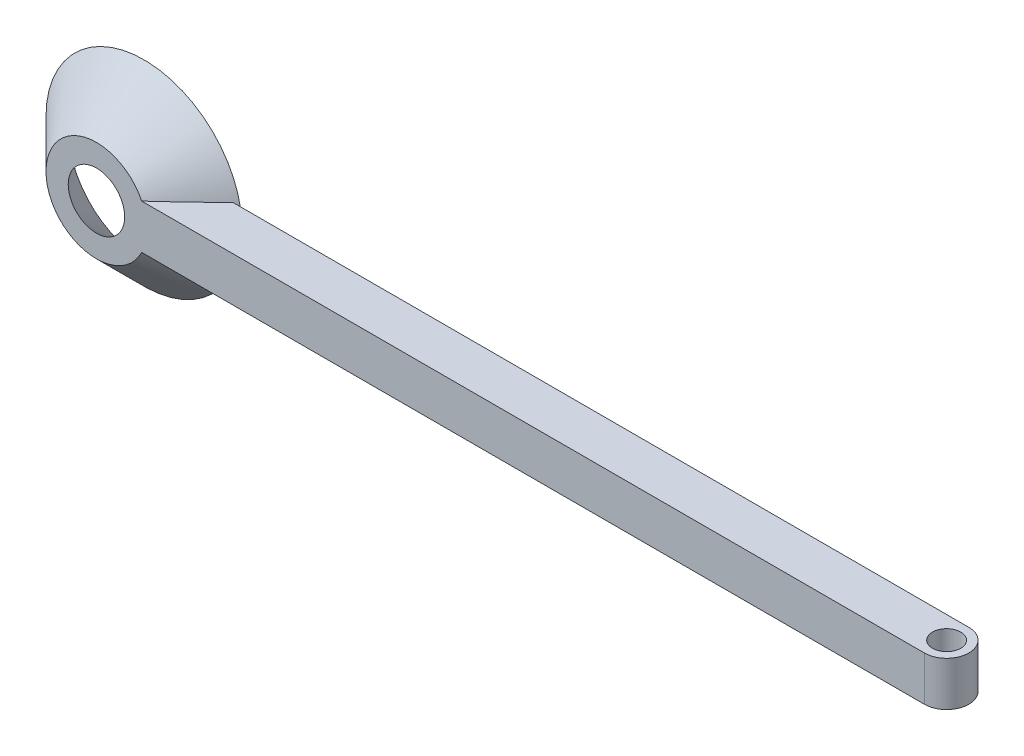
ISO-10303-21;
HEADER;
FILE_DESCRIPTION(('STEP AP214'),'2;1');
FILE_NAME('part.step','',(''),(''),'','','');
FILE_SCHEMA(('AUTOMOTIVE_DESIGN { 1 0 10303 214 1 1 1 1 }'));
ENDSEC;
DATA;
#1=APPLICATION_CONTEXT('core data for automotive mechanical design processes');
#2=APPLICATION_PROTOCOL_DEFINITION('international standard','automotive_design',2000,#1);
#3=PRODUCT_CONTEXT('',#1,'mechanical');
#4=PRODUCT('Part','Part','',(#3));
#5=PRODUCT_RELATED_PRODUCT_CATEGORY('part','',(#4));
#6=PRODUCT_DEFINITION_FORMATION('','',#4);
#7=PRODUCT_DEFINITION_CONTEXT('part definition',#1,'design');
#8=PRODUCT_DEFINITION('design','',#6,#7);
#9=PRODUCT_DEFINITION_SHAPE('','',#8);
#10=(LENGTH_UNIT() NAMED_UNIT(*) SI_UNIT(.MILLI.,.METRE.));
#11=(NAMED_UNIT(*) PLANE_ANGLE_UNIT() SI_UNIT($,.RADIAN.));
#12=(NAMED_UNIT(*) SI_UNIT($,.STERADIAN.) SOLID_ANGLE_UNIT());
#13=UNCERTAINTY_MEASURE_WITH_UNIT(LENGTH_MEASURE(1.E-05),#10,'distance_accuracy_value','');
#14=(GEOMETRIC_REPRESENTATION_CONTEXT(3) GLOBAL_UNCERTAINTY_ASSIGNED_CONTEXT((#13)) GLOBAL_UNIT_ASSIGNED_CONTEXT((#10,
#11,#12)) REPRESENTATION_CONTEXT('',''));
#15=CARTESIAN_POINT('',(0.,0.,0.));
#16=DIRECTION('',(0.,0.,1.));
#17=DIRECTION('',(1.,0.,0.));
#18=AXIS2_PLACEMENT_3D('',#15,#16,#17);
#19=CARTESIAN_POINT('',(0.,-5.,-5.));
#20=DIRECTION('',(0.,0.,-1.));
#21=DIRECTION('',(-1.,0.,0.));
#22=AXIS2_PLACEMENT_3D('',#19,#20,#21);
#23=PLANE('',#22);
#24=DIRECTION('',(-1.,0.,0.));
#25=VECTOR('',#24,1.);
#26=CARTESIAN_POINT('',(0.,-5.,-5.));
#27=LINE('',#26,#25);
#28=CARTESIAN_POINT('',(90.,-5.,-5.00000000000001));
#29=VERTEX_POINT('',#28);
#30=CARTESIAN_POINT('',(-75.5937358852803,-5.,-4.99999999999999));
#31=VERTEX_POINT('',#30);
#32=EDGE_CURVE('E98',#29,#31,#27,.T.);
#33=ORIENTED_EDGE('',*,*,#32,.T.);
#34=CARTESIAN_POINT('',(-96.35,0.,-4.99999999999999));
#35=DIRECTION('',(0.,0.,-1.));
#36=DIRECTION('',(-1.,0.,0.));
#37=AXIS2_PLACEMENT_3D('',#34,#35,#36);
#38=CIRCLE('',#37,21.35);
#39=CARTESIAN_POINT('',(-75.5937358852803,5.,-4.99999999999999));
#40=VERTEX_POINT('',#39);
#41=EDGE_CURVE('E81',#31,#40,#38,.F.);
#42=ORIENTED_EDGE('',*,*,#41,.T.);
#43=DIRECTION('',(-1.,0.,0.));
#44=VECTOR('',#43,1.);
#45=CARTESIAN_POINT('',(0.,5.,-5.));
#46=LINE('',#45,#44);
#47=CARTESIAN_POINT('',(90.,5.,-5.00000000000001));
#48=VERTEX_POINT('',#47);
#49=EDGE_CURVE('E111',#48,#40,#46,.T.);
#50=ORIENTED_EDGE('',*,*,#49,.F.);
#51=DIRECTION('',(0.,1.,0.));
#52=VECTOR('',#51,1.);
#53=CARTESIAN_POINT('',(90.,-5.,-5.00000000000001));
#54=LINE('',#53,#52);
#55=EDGE_CURVE('E97',#29,#48,#54,.T.);
#56=ORIENTED_EDGE('',*,*,#55,.F.);
#57=EDGE_LOOP('',(#33,#42,#50,#56));
#58=FACE_BOUND('',#57,.T.);
#59=ADVANCED_FACE('F35',(#58),#23,.T.);
#60=CARTESIAN_POINT('',(0.,-5.,0.));
#61=DIRECTION('',(0.,1.,0.));
#62=DIRECTION('',(0.,0.,1.));
#63=AXIS2_PLACEMENT_3D('',#60,#61,#62);
#64=PLANE('',#63);
#65=CARTESIAN_POINT('',(89.9999999999996,-5.,0.));
#66=DIRECTION('',(0.,1.,0.));
#67=DIRECTION('',(0.,0.,1.));
#68=AXIS2_PLACEMENT_3D('',#65,#66,#67);
#69=CIRCLE('',#68,3.17500000000001);
#70=CARTESIAN_POINT('',(89.9999999999996,-5.,3.175));
#71=VERTEX_POINT('',#70);
#72=EDGE_CURVE('E114',#71,#71,#69,.T.);
#73=ORIENTED_EDGE('',*,*,#72,.T.);
#74=EDGE_LOOP('',(#73));
#75=FACE_BOUND('',#74,.T.);
#76=CARTESIAN_POINT('',(-64.2027052285069,-5.,-16.1838064346191));
#77=CARTESIAN_POINT('',(-65.1454306610586,-5.,-15.2523281294728));
#78=CARTESIAN_POINT('',(-66.0885952776533,-5.,-14.3212933647983));
#79=CARTESIAN_POINT('',(-67.9767967716227,-5.,-12.4599410588139));
#80=CARTESIAN_POINT('',(-68.9218344516001,-5.,-11.529624331802));
#81=CARTESIAN_POINT('',(-70.8247178125633,-5.,-9.65977743919224));
#82=CARTESIAN_POINT('',(-71.7825834387421,-5.,-8.72026755784174));
#83=CARTESIAN_POINT('',(-73.2209120631241,-5.,-7.31315535013858));
#84=CARTESIAN_POINT('',(-73.7004624884924,-5.,-6.84462024994699));
#85=CARTESIAN_POINT('',(-74.6602905034531,-5.,-5.90830952626677));
#86=CARTESIAN_POINT('',(-75.140568082258,-5.,-5.44053389172052));
#87=CARTESIAN_POINT('',(-76.2860921001571,-5.,-4.32694382062105));
#88=CARTESIAN_POINT('',(-76.9517431387911,-5.,-3.68154528667366));
#89=CARTESIAN_POINT('',(-78.2853525297144,-5.,-2.39304950100073));
#90=CARTESIAN_POINT('',(-78.9533110276313,-5.,-1.7499523999368));
#91=CARTESIAN_POINT('',(-80.2937894091304,-5.,-0.465609860279055));
#92=CARTESIAN_POINT('',(-80.9663160394032,-5.,0.175628549114005));
#93=CARTESIAN_POINT('',(-81.9783990708816,-5.,1.13384877718588));
#94=CARTESIAN_POINT('',(-82.3162687932676,-5.,1.45261182123128));
#95=CARTESIAN_POINT('',(-82.9933877210529,-5.,2.08866879221842));
#96=CARTESIAN_POINT('',(-83.3326369233067,-5.,2.40596272250663));
#97=CARTESIAN_POINT('',(-84.0097154514108,-5.,3.03582215147635));
#98=CARTESIAN_POINT('',(-84.3475292524504,-5.,3.34840432488952));
#99=CARTESIAN_POINT('',(-85.0252441039228,-5.,3.97129814173362));
#100=CARTESIAN_POINT('',(-85.3651451498662,-5.,4.28160979004502));
#101=CARTESIAN_POINT('',(-86.0479259062229,-5.,4.89960317193267));
#102=CARTESIAN_POINT('',(-86.3908081502565,-5.,5.20728211232001));
#103=CARTESIAN_POINT('',(-86.9077081555876,-5.,5.66587227548237));
#104=CARTESIAN_POINT('',(-87.0804314232372,-5.,5.81824226774713));
#105=CARTESIAN_POINT('',(-87.4268824429795,-5.,6.12184856185156));
#106=CARTESIAN_POINT('',(-87.6006102346148,-5.,6.27308481851691));
#107=CARTESIAN_POINT('',(-88.1221189759651,-5.,6.7236177155396));
#108=CARTESIAN_POINT('',(-88.4715988973691,-5.,7.02096187775687));
#109=CARTESIAN_POINT('',(-89.0004279603917,-5.,7.46142396905846));
#110=CARTESIAN_POINT('',(-89.1774681399129,-5.,7.60731548564141));
#111=CARTESIAN_POINT('',(-89.5333724860336,-5.,7.89685420601316));
#112=CARTESIAN_POINT('',(-89.7122366186847,-5.,8.04050145144804));
#113=CARTESIAN_POINT('',(-90.0718710533435,-5.,8.32486434385216));
#114=CARTESIAN_POINT('',(-90.2526382847953,-5.,8.46558386731626));
#115=CARTESIAN_POINT('',(-90.6167387746962,-5.,8.74365633336697));
#116=CARTESIAN_POINT('',(-90.8000719190565,-5.,8.88100942489364));
#117=CARTESIAN_POINT('',(-91.1697427015212,-5.,9.15144550857356));
#118=CARTESIAN_POINT('',(-91.3560789653121,-5.,9.2845303750431));
#119=CARTESIAN_POINT('',(-91.7324519069781,-5.,9.5453456602855));
#120=CARTESIAN_POINT('',(-91.9224880538725,-5.,9.67307683920577));
#121=CARTESIAN_POINT('',(-92.1615530159626,-5.,9.82759082502684));
#122=CARTESIAN_POINT('',(-92.2084836399834,-5.,9.85763267640777));
#123=CARTESIAN_POINT('',(-92.302625989668,-5.,9.91727832985348));
#124=CARTESIAN_POINT('',(-92.3498377297726,-5.,9.94688210913769));
#125=CARTESIAN_POINT('',(-92.4919192380772,-5.,10.0349969014896));
#126=CARTESIAN_POINT('',(-92.5872262886891,-5.,10.0928055341881));
#127=CARTESIAN_POINT('',(-92.7791222521322,-5.,10.2062895099608));
#128=CARTESIAN_POINT('',(-92.8757113300107,-5.,10.2619645747035));
#129=CARTESIAN_POINT('',(-93.0702626609801,-5.,10.3708540094377));
#130=CARTESIAN_POINT('',(-93.1682248937748,-5.,10.4240684157499));
#131=CARTESIAN_POINT('',(-93.4630645210796,-5.,10.5788246801675));
#132=CARTESIAN_POINT('',(-93.662149132975,-5.,10.6762317463084));
#133=CARTESIAN_POINT('',(-94.0669035656325,-5.,10.8563908960805));
#134=CARTESIAN_POINT('',(-94.2725716502911,-5.,10.9391468063276));
#135=CARTESIAN_POINT('',(-94.6277505258524,-5.,11.0634675144655));
#136=CARTESIAN_POINT('',(-94.7755380492069,-5.,11.1099339764786));
#137=CARTESIAN_POINT('',(-95.0741592179826,-5.,11.1917860860787));
#138=CARTESIAN_POINT('',(-95.2249921702169,-5.,11.2271742256607));
#139=CARTESIAN_POINT('',(-95.5282907343687,-5.,11.2851024475581));
#140=CARTESIAN_POINT('',(-95.680743035165,-5.,11.3077112456342));
#141=CARTESIAN_POINT('',(-95.9870800296896,-5.,11.3391604241388));
#142=CARTESIAN_POINT('',(-96.1409646747562,-5.,11.3480012706082));
#143=CARTESIAN_POINT('',(-96.4490419580736,-5.,11.3513938215267));
#144=CARTESIAN_POINT('',(-96.6032347501485,-5.,11.3459318326825));
#145=CARTESIAN_POINT('',(-96.910477214965,-5.,11.3210164301969));
#146=CARTESIAN_POINT('',(-97.0635267956689,-5.,11.301561902053));
#147=CARTESIAN_POINT('',(-97.3691861766345,-5.,11.2494336800775));
#148=CARTESIAN_POINT('',(-97.5217695109291,-5.,11.2166068162567));
#149=CARTESIAN_POINT('',(-97.8238991092357,-5.,11.1393339010768));
#150=CARTESIAN_POINT('',(-97.9734455468259,-5.,11.0948885158159));
#151=CARTESIAN_POINT('',(-98.401960649359,-5.,10.9518087643451));
#152=CARTESIAN_POINT('',(-98.6766652650818,-5.,10.840333444393));
#153=CARTESIAN_POINT('',(-99.0801058917182,-5.,10.6544567433044));
#154=CARTESIAN_POINT('',(-99.2133317962307,-5.,10.5892820905881));
#155=CARTESIAN_POINT('',(-99.4771129076315,-5.,10.4537273994035));
#156=CARTESIAN_POINT('',(-99.607668438466,-5.,10.383347997168));
#157=CARTESIAN_POINT('',(-99.8618684316424,-5.,10.2407828565494));
#158=CARTESIAN_POINT('',(-99.9855958014017,-5.,10.1687436198021));
#159=CARTESIAN_POINT('',(-100.231023361649,-5.,10.0212778174012));
#160=CARTESIAN_POINT('',(-100.352723414586,-5.,9.94585102317874));
#161=CARTESIAN_POINT('',(-100.593580277383,-5.,9.79260877394597));
#162=CARTESIAN_POINT('',(-100.712747955537,-5.,9.7148103359953));
#163=CARTESIAN_POINT('',(-100.949447609256,-5.,9.55682605176389));
#164=CARTESIAN_POINT('',(-101.066979998045,-5.,9.47664082529422));
#165=CARTESIAN_POINT('',(-101.183806434619,-5.,9.39545582749201));
#166=B_SPLINE_CURVE_WITH_KNOTS('',3,(#76,#77,#78,#79,#80,#81,#82,#83,#84,#85,#86,#87,#88,#89,
#90,#91,#92,#93,#94,#95,#96,#97,#98,#99,#100,#101,#102,#103,#104,#105,#106,#107,#108,#109,#110,
#111,#112,#113,#114,#115,#116,#117,#118,#119,#120,#121,#122,#123,#124,#125,#126,#127,#128,#129,
#130,#131,#132,#133,#134,#135,#136,#137,#138,#139,#140,#141,#142,#143,#144,#145,#146,#147,#148,
#149,#150,#151,#152,#153,#154,#155,#156,#157,#158,#159,#160,#161,#162,#163,#164,#165),
.UNSPECIFIED.,.F.,.F.,(4,2,2,2,2,2,2,2,2,2,2,2,2,2,2,2,2,2,2,2,2,2,2,2,2,2,2,2,2,2,2,2,2,2,2,2,
2,2,2,2,2,2,2,2,4),(0.,3.97585889793892,7.95420766716726,11.9793335614988,13.9906617333336,
16.0019603532867,18.7834437774279,21.5651060751781,24.352794277439,25.7463089491354,
27.1398204449989,28.5205482226047,29.9012730314879,31.2833158362956,31.97428820838,
32.6652879678378,34.0417695952898,34.7299768588404,35.41817133639,36.105387684535,
36.7925735732848,37.4794534453911,38.1662354576484,38.3334011522863,38.5005755095169,
38.8349564103307,39.169380784854,39.5038002215336,40.1682572162939,40.8325404100985,
41.2969443055918,41.761243661324,42.2230220866671,42.6847848806163,43.1469899200689,
43.6092317781263,44.076924202512,44.5445898196285,45.4318504103131,45.8767371063952,
46.3215695087672,46.7510275730483,47.1805146578308,47.6074287678956,48.0342329660593),.UNSPECIFIED.);
#167=CARTESIAN_POINT('',(-86.1606673427549,-5.,4.99999999999999));
#168=VERTEX_POINT('',#167);
#169=EDGE_CURVE('E78',#31,#168,#166,.T.);
#170=ORIENTED_EDGE('',*,*,#169,.F.);
#171=ORIENTED_EDGE('',*,*,#32,.F.);
#172=CARTESIAN_POINT('',(89.9999999999996,-5.,0.));
#173=DIRECTION('',(0.,1.,0.));
#174=DIRECTION('',(0.,0.,1.));
#175=AXIS2_PLACEMENT_3D('',#172,#173,#174);
#176=CIRCLE('',#175,5.);
#177=CARTESIAN_POINT('',(90.,-5.,4.99999999999999));
#178=VERTEX_POINT('',#177);
#179=EDGE_CURVE('E95',#29,#178,#176,.F.);
#180=ORIENTED_EDGE('',*,*,#179,.T.);
#181=DIRECTION('',(-1.,0.,0.));
#182=VECTOR('',#181,1.);
#183=CARTESIAN_POINT('',(0.,-5.,5.));
#184=LINE('',#183,#182);
#185=EDGE_CURVE('E61',#178,#168,#184,.T.);
#186=ORIENTED_EDGE('',*,*,#185,.T.);
#187=EDGE_LOOP('',(#170,#171,#180,#186));
#188=FACE_BOUND('',#187,.T.);
#189=ADVANCED_FACE('F93',(#75,#188),#64,.F.);
#190=CARTESIAN_POINT('',(0.,5.,0.));
#191=DIRECTION('',(0.,1.,0.));
#192=DIRECTION('',(0.,0.,1.));
#193=AXIS2_PLACEMENT_3D('',#190,#191,#192);
#194=PLANE('',#193);
#195=CARTESIAN_POINT('',(89.9999999999996,5.,0.));
#196=DIRECTION('',(0.,1.,0.));
#197=DIRECTION('',(0.,0.,1.));
#198=AXIS2_PLACEMENT_3D('',#195,#196,#197);
#199=CIRCLE('',#198,3.17500000000001);
#200=CARTESIAN_POINT('',(89.9999999999996,5.,3.175));
#201=VERTEX_POINT('',#200);
#202=EDGE_CURVE('E85',#201,#201,#199,.T.);
#203=ORIENTED_EDGE('',*,*,#202,.F.);
#204=EDGE_LOOP('',(#203));
#205=FACE_BOUND('',#204,.T.);
#206=ORIENTED_EDGE('',*,*,#49,.T.);
#207=CARTESIAN_POINT('',(-64.2027052285069,5.,-16.1838064346191));
#208=CARTESIAN_POINT('',(-65.1454306610586,5.,-15.2523281294728));
#209=CARTESIAN_POINT('',(-66.0885952776533,5.,-14.3212933647983));
#210=CARTESIAN_POINT('',(-67.9767967716227,5.,-12.4599410588139));
#211=CARTESIAN_POINT('',(-68.9218344516001,5.,-11.529624331802));
#212=CARTESIAN_POINT('',(-70.8247178125633,5.,-9.65977743919224));
#213=CARTESIAN_POINT('',(-71.7825834387421,5.,-8.72026755784174));
#214=CARTESIAN_POINT('',(-73.2209120631241,5.,-7.31315535013858));
#215=CARTESIAN_POINT('',(-73.7004624884924,5.,-6.84462024994699));
#216=CARTESIAN_POINT('',(-74.6602905034531,5.,-5.90830952626677));
#217=CARTESIAN_POINT('',(-75.140568082258,5.,-5.44053389172052));
#218=CARTESIAN_POINT('',(-76.2860921001571,5.,-4.32694382062105));
#219=CARTESIAN_POINT('',(-76.9517431387911,5.,-3.68154528667366));
#220=CARTESIAN_POINT('',(-78.2853525297144,5.,-2.39304950100073));
#221=CARTESIAN_POINT('',(-78.9533110276313,5.,-1.7499523999368));
#222=CARTESIAN_POINT('',(-80.2937894091304,5.,-0.465609860279055));
#223=CARTESIAN_POINT('',(-80.9663160394032,5.,0.175628549114005));
#224=CARTESIAN_POINT('',(-81.9783990708816,5.,1.13384877718588));
#225=CARTESIAN_POINT('',(-82.3162687932676,5.,1.45261182123128));
#226=CARTESIAN_POINT('',(-82.9933877210529,5.,2.08866879221842));
#227=CARTESIAN_POINT('',(-83.3326369233067,5.,2.40596272250663));
#228=CARTESIAN_POINT('',(-84.0097154514108,5.,3.03582215147635));
#229=CARTESIAN_POINT('',(-84.3475292524504,5.,3.34840432488952));
#230=CARTESIAN_POINT('',(-85.0252441039228,5.,3.97129814173362));
#231=CARTESIAN_POINT('',(-85.3651451498662,5.,4.28160979004502));
#232=CARTESIAN_POINT('',(-86.0479259062229,5.,4.89960317193267));
#233=CARTESIAN_POINT('',(-86.3908081502565,5.,5.20728211232001));
#234=CARTESIAN_POINT('',(-86.9077081555876,5.,5.66587227548237));
#235=CARTESIAN_POINT('',(-87.0804314232372,5.,5.81824226774713));
#236=CARTESIAN_POINT('',(-87.4268824429795,5.,6.12184856185156));
#237=CARTESIAN_POINT('',(-87.6006102346148,5.,6.27308481851691));
#238=CARTESIAN_POINT('',(-88.1221189759651,5.,6.7236177155396));
#239=CARTESIAN_POINT('',(-88.4715988973691,5.,7.02096187775687));
#240=CARTESIAN_POINT('',(-89.0004279603917,5.,7.46142396905846));
#241=CARTESIAN_POINT('',(-89.1774681399129,5.,7.60731548564141));
#242=CARTESIAN_POINT('',(-89.5333724860336,5.,7.89685420601316));
#243=CARTESIAN_POINT('',(-89.7122366186847,5.,8.04050145144804));
#244=CARTESIAN_POINT('',(-90.0718710533435,5.,8.32486434385216));
#245=CARTESIAN_POINT('',(-90.2526382847953,5.,8.46558386731626));
#246=CARTESIAN_POINT('',(-90.6167387746962,5.,8.74365633336697));
#247=CARTESIAN_POINT('',(-90.8000719190565,5.,8.88100942489364));
#248=CARTESIAN_POINT('',(-91.1697427015212,5.,9.15144550857356));
#249=CARTESIAN_POINT('',(-91.3560789653121,5.,9.2845303750431));
#250=CARTESIAN_POINT('',(-91.7324519069781,5.,9.5453456602855));
#251=CARTESIAN_POINT('',(-91.9224880538725,5.,9.67307683920577));
#252=CARTESIAN_POINT('',(-92.1615530159626,5.,9.82759082502684));
#253=CARTESIAN_POINT('',(-92.2084836399834,5.,9.85763267640777));
#254=CARTESIAN_POINT('',(-92.302625989668,5.,9.91727832985348));
#255=CARTESIAN_POINT('',(-92.3498377297726,5.,9.94688210913769));
#256=CARTESIAN_POINT('',(-92.4919192380772,5.,10.0349969014896));
#257=CARTESIAN_POINT('',(-92.5872262886891,5.,10.0928055341881));
#258=CARTESIAN_POINT('',(-92.7791222521322,5.,10.2062895099608));
#259=CARTESIAN_POINT('',(-92.8757113300107,5.,10.2619645747035));
#260=CARTESIAN_POINT('',(-93.0702626609801,5.,10.3708540094377));
#261=CARTESIAN_POINT('',(-93.1682248937748,5.,10.4240684157499));
#262=CARTESIAN_POINT('',(-93.4630645210796,5.,10.5788246801675));
#263=CARTESIAN_POINT('',(-93.662149132975,5.,10.6762317463084));
#264=CARTESIAN_POINT('',(-94.0669035656325,5.,10.8563908960805));
#265=CARTESIAN_POINT('',(-94.2725716502911,5.,10.9391468063276));
#266=CARTESIAN_POINT('',(-94.6277505258524,5.,11.0634675144655));
#267=CARTESIAN_POINT('',(-94.7755380492069,5.,11.1099339764786));
#268=CARTESIAN_POINT('',(-95.0741592179826,5.,11.1917860860787));
#269=CARTESIAN_POINT('',(-95.2249921702169,5.,11.2271742256607));
#270=CARTESIAN_POINT('',(-95.5282907343687,5.,11.2851024475581));
#271=CARTESIAN_POINT('',(-95.680743035165,5.,11.3077112456342));
#272=CARTESIAN_POINT('',(-95.9870800296896,5.,11.3391604241388));
#273=CARTESIAN_POINT('',(-96.1409646747562,5.,11.3480012706082));
#274=CARTESIAN_POINT('',(-96.4490419580736,5.,11.3513938215267));
#275=CARTESIAN_POINT('',(-96.6032347501485,5.,11.3459318326825));
#276=CARTESIAN_POINT('',(-96.910477214965,5.,11.3210164301969));
#277=CARTESIAN_POINT('',(-97.0635267956689,5.,11.301561902053));
#278=CARTESIAN_POINT('',(-97.3691861766345,5.,11.2494336800775));
#279=CARTESIAN_POINT('',(-97.5217695109291,5.,11.2166068162567));
#280=CARTESIAN_POINT('',(-97.8238991092357,5.,11.1393339010768));
#281=CARTESIAN_POINT('',(-97.9734455468259,5.,11.0948885158159));
#282=CARTESIAN_POINT('',(-98.401960649359,5.,10.9518087643451));
#283=CARTESIAN_POINT('',(-98.6766652650818,5.,10.840333444393));
#284=CARTESIAN_POINT('',(-99.0801058917182,5.,10.6544567433044));
#285=CARTESIAN_POINT('',(-99.2133317962307,5.,10.5892820905881));
#286=CARTESIAN_POINT('',(-99.4771129076315,5.,10.4537273994035));
#287=CARTESIAN_POINT('',(-99.607668438466,5.,10.383347997168));
#288=CARTESIAN_POINT('',(-99.8618684316424,5.,10.2407828565494));
#289=CARTESIAN_POINT('',(-99.9855958014017,5.,10.1687436198021));
#290=CARTESIAN_POINT('',(-100.231023361649,5.,10.0212778174012));
#291=CARTESIAN_POINT('',(-100.352723414586,5.,9.94585102317874));
#292=CARTESIAN_POINT('',(-100.593580277383,5.,9.79260877394597));
#293=CARTESIAN_POINT('',(-100.712747955537,5.,9.7148103359953));
#294=CARTESIAN_POINT('',(-100.949447609256,5.,9.55682605176389));
#295=CARTESIAN_POINT('',(-101.066979998045,5.,9.47664082529422));
#296=CARTESIAN_POINT('',(-101.183806434619,5.,9.39545582749201));
#297=B_SPLINE_CURVE_WITH_KNOTS('',3,(#207,#208,#209,#210,#211,#212,#213,#214,#215,#216,#217,
#218,#219,#220,#221,#222,#223,#224,#225,#226,#227,#228,#229,#230,#231,#232,#233,#234,#235,#236,
#237,#238,#239,#240,#241,#242,#243,#244,#245,#246,#247,#248,#249,#250,#251,#252,#253,#254,#255,
#256,#257,#258,#259,#260,#261,#262,#263,#264,#265,#266,#267,#268,#269,#270,#271,#272,#273,#274,
#275,#276,#277,#278,#279,#280,#281,#282,#283,#284,#285,#286,#287,#288,#289,#290,#291,#292,#293,
#294,#295,#296),.UNSPECIFIED.,.F.,.F.,(4,2,2,2,2,2,2,2,2,2,2,2,2,2,2,2,2,2,2,2,2,2,2,2,2,2,2,2,
2,2,2,2,2,2,2,2,2,2,2,2,2,2,2,2,4),(0.,3.97585889793892,7.95420766716726,11.9793335614988,
13.9906617333336,16.0019603532867,18.7834437774279,21.5651060751781,24.352794277439,
25.7463089491354,27.1398204449989,28.5205482226047,29.9012730314879,31.2833158362956,
31.97428820838,32.6652879678378,34.0417695952898,34.7299768588404,35.41817133639,
36.105387684535,36.7925735732848,37.4794534453911,38.1662354576484,38.3334011522863,
38.5005755095169,38.8349564103307,39.169380784854,39.5038002215336,40.1682572162939,
40.8325404100985,41.2969443055918,41.761243661324,42.2230220866671,42.6847848806163,
43.1469899200689,43.6092317781263,44.076924202512,44.5445898196285,45.4318504103131,
45.8767371063952,46.3215695087672,46.7510275730483,47.1805146578308,47.6074287678956,
48.0342329660593),.UNSPECIFIED.);
#298=CARTESIAN_POINT('',(-86.160667342755,5.,5.00000000000001));
#299=VERTEX_POINT('',#298);
#300=EDGE_CURVE('E11',#40,#299,#297,.T.);
#301=ORIENTED_EDGE('',*,*,#300,.T.);
#302=DIRECTION('',(-1.,0.,0.));
#303=VECTOR('',#302,1.);
#304=CARTESIAN_POINT('',(0.,5.,5.));
#305=LINE('',#304,#303);
#306=CARTESIAN_POINT('',(90.,5.,4.99999999999999));
#307=VERTEX_POINT('',#306);
#308=EDGE_CURVE('E90',#307,#299,#305,.T.);
#309=ORIENTED_EDGE('',*,*,#308,.F.);
#310=CARTESIAN_POINT('',(89.9999999999996,5.,0.));
#311=DIRECTION('',(0.,1.,0.));
#312=DIRECTION('',(0.,0.,1.));
#313=AXIS2_PLACEMENT_3D('',#310,#311,#312);
#314=CIRCLE('',#313,5.);
#315=EDGE_CURVE('E106',#48,#307,#314,.F.);
#316=ORIENTED_EDGE('',*,*,#315,.F.);
#317=EDGE_LOOP('',(#206,#301,#309,#316));
#318=FACE_BOUND('',#317,.T.);
#319=ADVANCED_FACE('F113',(#205,#318),#194,.T.);
#320=CARTESIAN_POINT('',(89.9999999999996,-5.,0.));
#321=DIRECTION('',(0.,1.,0.));
#322=DIRECTION('',(0.,0.,1.));
#323=AXIS2_PLACEMENT_3D('',#320,#321,#322);
#324=CYLINDRICAL_SURFACE('',#323,5.);
#325=ORIENTED_EDGE('',*,*,#55,.T.);
#326=ORIENTED_EDGE('',*,*,#315,.T.);
#327=DIRECTION('',(0.,1.,0.));
#328=VECTOR('',#327,1.);
#329=CARTESIAN_POINT('',(90.,-5.,4.99999999999999));
#330=LINE('',#329,#328);
#331=EDGE_CURVE('E48',#178,#307,#330,.T.);
#332=ORIENTED_EDGE('',*,*,#331,.F.);
#333=ORIENTED_EDGE('',*,*,#179,.F.);
#334=EDGE_LOOP('',(#325,#326,#332,#333));
#335=FACE_BOUND('',#334,.T.);
#336=ADVANCED_FACE('F107',(#335),#324,.T.);
#337=CARTESIAN_POINT('',(0.,-5.,5.));
#338=DIRECTION('',(0.,0.,-1.));
#339=DIRECTION('',(-1.,0.,0.));
#340=AXIS2_PLACEMENT_3D('',#337,#338,#339);
#341=PLANE('',#340);
#342=CARTESIAN_POINT('',(-96.35,0.,4.99999999999999));
#343=DIRECTION('',(0.,0.,-1.));
#344=DIRECTION('',(-1.,0.,0.));
#345=AXIS2_PLACEMENT_3D('',#342,#343,#344);
#346=CIRCLE('',#345,6.34999999999999);
#347=CARTESIAN_POINT('',(-102.7,0.,4.99999999999999));
#348=VERTEX_POINT('',#347);
#349=EDGE_CURVE('E158',#348,#348,#346,.T.);
#350=ORIENTED_EDGE('',*,*,#349,.T.);
#351=EDGE_LOOP('',(#350));
#352=FACE_BOUND('',#351,.T.);
#353=CARTESIAN_POINT('',(-96.35,0.,4.99999999999999));
#354=DIRECTION('',(0.,0.,-1.));
#355=DIRECTION('',(-1.,0.,0.));
#356=AXIS2_PLACEMENT_3D('',#353,#354,#355);
#357=CIRCLE('',#356,11.35);
#358=EDGE_CURVE('E55',#168,#299,#357,.T.);
#359=ORIENTED_EDGE('',*,*,#358,.F.);
#360=ORIENTED_EDGE('',*,*,#185,.F.);
#361=ORIENTED_EDGE('',*,*,#331,.T.);
#362=ORIENTED_EDGE('',*,*,#308,.T.);
#363=EDGE_LOOP('',(#359,#360,#361,#362));
#364=FACE_BOUND('',#363,.T.);
#365=ADVANCED_FACE('F88',(#352,#364),#341,.F.);
#366=CARTESIAN_POINT('',(89.9999999999996,-5.,0.));
#367=DIRECTION('',(0.,1.,0.));
#368=DIRECTION('',(0.,0.,1.));
#369=AXIS2_PLACEMENT_3D('',#366,#367,#368);
#370=CYLINDRICAL_SURFACE('',#369,3.17500000000001);
#371=ORIENTED_EDGE('',*,*,#72,.F.);
#372=EDGE_LOOP('',(#371));
#373=FACE_BOUND('',#372,.T.);
#374=ORIENTED_EDGE('',*,*,#202,.T.);
#375=EDGE_LOOP('',(#374));
#376=FACE_BOUND('',#375,.T.);
#377=ADVANCED_FACE('F37',(#373,#376),#370,.F.);
#378=CARTESIAN_POINT('',(-96.35,0.,4.99999999999999));
#379=DIRECTION('',(0.,0.,-1.));
#380=DIRECTION('',(-1.,0.,0.));
#381=AXIS2_PLACEMENT_3D('',#378,#379,#380);
#382=CONICAL_SURFACE('',#381,11.35,0.78539816339745);
#383=CARTESIAN_POINT('',(-96.35,0.,-5.729753555007));
#384=DIRECTION('',(0.,0.,-1.));
#385=DIRECTION('',(-1.,0.,0.));
#386=AXIS2_PLACEMENT_3D('',#383,#384,#385);
#387=CIRCLE('',#386,22.079753555007);
#388=CARTESIAN_POINT('',(-118.429753555007,0.,-5.729753555007));
#389=VERTEX_POINT('',#388);
#390=EDGE_CURVE('E91',#389,#389,#387,.T.);
#391=ORIENTED_EDGE('',*,*,#390,.F.);
#392=EDGE_LOOP('',(#391));
#393=FACE_BOUND('',#392,.T.);
#394=ORIENTED_EDGE('',*,*,#41,.F.);
#395=ORIENTED_EDGE('',*,*,#169,.T.);
#396=ORIENTED_EDGE('',*,*,#358,.T.);
#397=ORIENTED_EDGE('',*,*,#300,.F.);
#398=EDGE_LOOP('',(#394,#395,#396,#397));
#399=FACE_BOUND('',#398,.T.);
#400=ADVANCED_FACE('F79',(#393,#399),#382,.T.);
#401=CARTESIAN_POINT('',(-96.35,0.,-5.729753555007));
#402=DIRECTION('',(0.,0.,-1.));
#403=DIRECTION('',(-1.,0.,0.));
#404=AXIS2_PLACEMENT_3D('',#401,#402,#403);
#405=CONICAL_SURFACE('',#404,17.079753555007,0.78539816339745);
#406=CARTESIAN_POINT('',(-96.35,0.,-5.729753555007));
#407=DIRECTION('',(0.,0.,-1.));
#408=DIRECTION('',(-1.,0.,0.));
#409=AXIS2_PLACEMENT_3D('',#406,#407,#408);
#410=CIRCLE('',#409,17.079753555007);
#411=CARTESIAN_POINT('',(-113.429753555007,0.,-5.729753555007));
#412=VERTEX_POINT('',#411);
#413=EDGE_CURVE('E160',#412,#412,#410,.T.);
#414=ORIENTED_EDGE('',*,*,#413,.T.);
#415=EDGE_LOOP('',(#414));
#416=FACE_BOUND('',#415,.T.);
#417=ORIENTED_EDGE('',*,*,#349,.F.);
#418=EDGE_LOOP('',(#417));
#419=FACE_BOUND('',#418,.T.);
#420=ADVANCED_FACE('F131',(#416,#419),#405,.F.);
#421=CARTESIAN_POINT('',(-74.2702464449929,0.,-5.729753555007));
#422=DIRECTION('',(0.,0.,1.));
#423=DIRECTION('',(1.,0.,0.));
#424=AXIS2_PLACEMENT_3D('',#421,#422,#423);
#425=PLANE('',#424);
#426=ORIENTED_EDGE('',*,*,#413,.F.);
#427=EDGE_LOOP('',(#426));
#428=FACE_BOUND('',#427,.T.);
#429=ORIENTED_EDGE('',*,*,#390,.T.);
#430=EDGE_LOOP('',(#429));
#431=FACE_BOUND('',#430,.T.);
#432=ADVANCED_FACE('F133',(#428,#431),#425,.F.);
#433=CLOSED_SHELL('',(#59,#189,#319,#336,#365,#377,#400,#420,#432));
#434=MANIFOLD_SOLID_BREP('B2',#433);
#435=ADVANCED_BREP_SHAPE_REPRESENTATION('',(#18,#434),#14);
#436=SHAPE_DEFINITION_REPRESENTATION(#9,#435);
ENDSEC;
END-ISO-10303-21;
